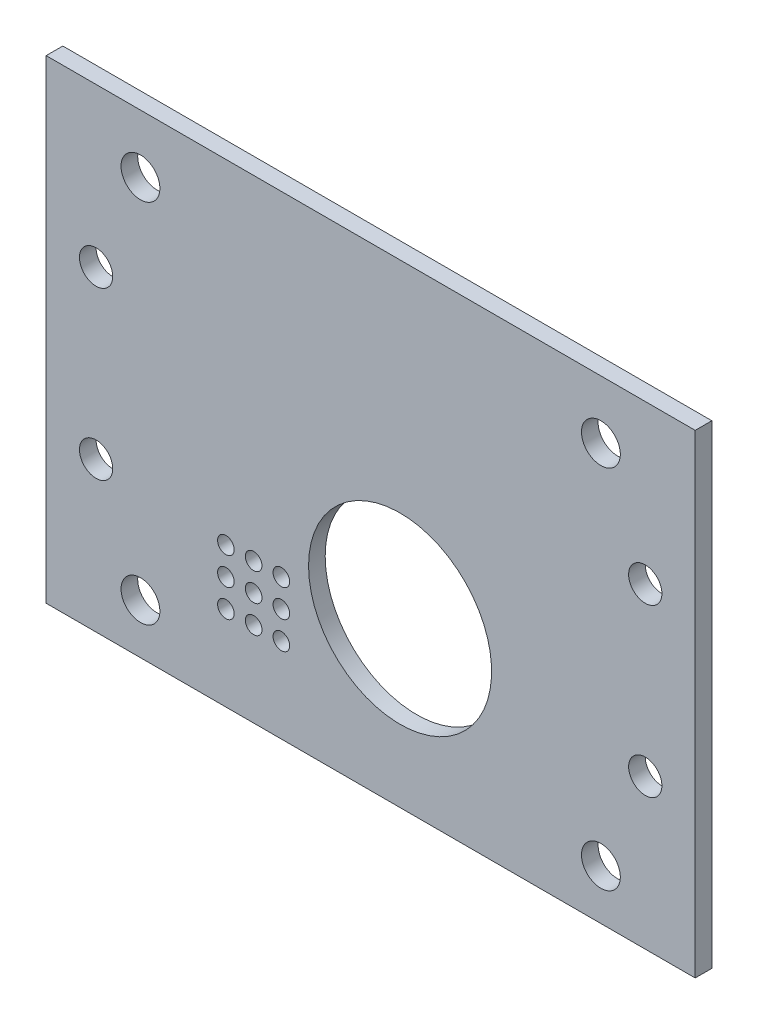
ISO-10303-21;
HEADER;
FILE_DESCRIPTION(('STEP AP214'),'2;1');
FILE_NAME('part.step','',(''),(''),'','','');
FILE_SCHEMA(('AUTOMOTIVE_DESIGN { 1 0 10303 214 1 1 1 1 }'));
ENDSEC;
DATA;
#1=APPLICATION_CONTEXT('core data for automotive mechanical design processes');
#2=APPLICATION_PROTOCOL_DEFINITION('international standard','automotive_design',2000,#1);
#3=PRODUCT_CONTEXT('',#1,'mechanical');
#4=PRODUCT('Part','Part','',(#3));
#5=PRODUCT_RELATED_PRODUCT_CATEGORY('part','',(#4));
#6=PRODUCT_DEFINITION_FORMATION('','',#4);
#7=PRODUCT_DEFINITION_CONTEXT('part definition',#1,'design');
#8=PRODUCT_DEFINITION('design','',#6,#7);
#9=PRODUCT_DEFINITION_SHAPE('','',#8);
#10=(LENGTH_UNIT() NAMED_UNIT(*) SI_UNIT(.MILLI.,.METRE.));
#11=(NAMED_UNIT(*) PLANE_ANGLE_UNIT() SI_UNIT($,.RADIAN.));
#12=(NAMED_UNIT(*) SI_UNIT($,.STERADIAN.) SOLID_ANGLE_UNIT());
#13=UNCERTAINTY_MEASURE_WITH_UNIT(LENGTH_MEASURE(1.E-05),#10,'distance_accuracy_value','');
#14=(GEOMETRIC_REPRESENTATION_CONTEXT(3) GLOBAL_UNCERTAINTY_ASSIGNED_CONTEXT((#13)) GLOBAL_UNIT_ASSIGNED_CONTEXT((#10,
#11,#12)) REPRESENTATION_CONTEXT('',''));
#15=CARTESIAN_POINT('',(0.,0.,0.));
#16=DIRECTION('',(0.,0.,1.));
#17=DIRECTION('',(1.,0.,0.));
#18=AXIS2_PLACEMENT_3D('',#15,#16,#17);
#19=CARTESIAN_POINT('',(-5.,-2.,3.));
#20=DIRECTION('',(1.,0.,0.));
#21=DIRECTION('',(0.,0.,-1.));
#22=AXIS2_PLACEMENT_3D('',#19,#20,#21);
#23=PLANE('',#22);
#24=DIRECTION('',(0.,-1.,0.));
#25=VECTOR('',#24,1.);
#26=CARTESIAN_POINT('',(-5.,-2.,0.));
#27=LINE('',#26,#25);
#28=CARTESIAN_POINT('',(-5.,83.5,0.));
#29=VERTEX_POINT('',#28);
#30=CARTESIAN_POINT('',(-5.,-2.,0.));
#31=VERTEX_POINT('',#30);
#32=EDGE_CURVE('E82',#29,#31,#27,.T.);
#33=ORIENTED_EDGE('',*,*,#32,.T.);
#34=DIRECTION('',(0.,0.,-1.));
#35=VECTOR('',#34,1.);
#36=CARTESIAN_POINT('',(-5.,-2.,3.));
#37=LINE('',#36,#35);
#38=CARTESIAN_POINT('',(-5.,-2.,3.));
#39=VERTEX_POINT('',#38);
#40=EDGE_CURVE('E11',#39,#31,#37,.T.);
#41=ORIENTED_EDGE('',*,*,#40,.F.);
#42=DIRECTION('',(0.,-1.,0.));
#43=VECTOR('',#42,1.);
#44=CARTESIAN_POINT('',(-5.,-2.,3.));
#45=LINE('',#44,#43);
#46=CARTESIAN_POINT('',(-5.,83.5,3.));
#47=VERTEX_POINT('',#46);
#48=EDGE_CURVE('E73',#47,#39,#45,.T.);
#49=ORIENTED_EDGE('',*,*,#48,.F.);
#50=DIRECTION('',(0.,0.,-1.));
#51=VECTOR('',#50,1.);
#52=CARTESIAN_POINT('',(-5.,83.5,3.));
#53=LINE('',#52,#51);
#54=EDGE_CURVE('E93',#47,#29,#53,.T.);
#55=ORIENTED_EDGE('',*,*,#54,.T.);
#56=EDGE_LOOP('',(#33,#41,#49,#55));
#57=FACE_BOUND('',#56,.T.);
#58=ADVANCED_FACE('F39',(#57),#23,.F.);
#59=CARTESIAN_POINT('',(-5.,-2.,3.));
#60=DIRECTION('',(0.,1.,0.));
#61=DIRECTION('',(0.,0.,1.));
#62=AXIS2_PLACEMENT_3D('',#59,#60,#61);
#63=PLANE('',#62);
#64=DIRECTION('',(1.,0.,0.));
#65=VECTOR('',#64,1.);
#66=CARTESIAN_POINT('',(-5.,-2.,0.));
#67=LINE('',#66,#65);
#68=CARTESIAN_POINT('',(112.,-2.,0.));
#69=VERTEX_POINT('',#68);
#70=EDGE_CURVE('E66',#31,#69,#67,.T.);
#71=ORIENTED_EDGE('',*,*,#70,.T.);
#72=DIRECTION('',(0.,0.,-1.));
#73=VECTOR('',#72,1.);
#74=CARTESIAN_POINT('',(112.,-2.,3.));
#75=LINE('',#74,#73);
#76=CARTESIAN_POINT('',(112.,-2.,3.));
#77=VERTEX_POINT('',#76);
#78=EDGE_CURVE('E47',#77,#69,#75,.T.);
#79=ORIENTED_EDGE('',*,*,#78,.F.);
#80=DIRECTION('',(1.,0.,0.));
#81=VECTOR('',#80,1.);
#82=CARTESIAN_POINT('',(-5.,-2.,3.));
#83=LINE('',#82,#81);
#84=EDGE_CURVE('E55',#39,#77,#83,.T.);
#85=ORIENTED_EDGE('',*,*,#84,.F.);
#86=ORIENTED_EDGE('',*,*,#40,.T.);
#87=EDGE_LOOP('',(#71,#79,#85,#86));
#88=FACE_BOUND('',#87,.T.);
#89=ADVANCED_FACE('F220',(#88),#63,.F.);
#90=CARTESIAN_POINT('',(112.,-2.,3.));
#91=DIRECTION('',(-1.,0.,0.));
#92=DIRECTION('',(0.,0.,1.));
#93=AXIS2_PLACEMENT_3D('',#90,#91,#92);
#94=PLANE('',#93);
#95=DIRECTION('',(0.,1.,0.));
#96=VECTOR('',#95,1.);
#97=CARTESIAN_POINT('',(112.,-2.,0.));
#98=LINE('',#97,#96);
#99=CARTESIAN_POINT('',(112.,83.5,0.));
#100=VERTEX_POINT('',#99);
#101=EDGE_CURVE('E210',#69,#100,#98,.T.);
#102=ORIENTED_EDGE('',*,*,#101,.T.);
#103=DIRECTION('',(0.,0.,-1.));
#104=VECTOR('',#103,1.);
#105=CARTESIAN_POINT('',(112.,83.5,3.));
#106=LINE('',#105,#104);
#107=CARTESIAN_POINT('',(112.,83.5,3.));
#108=VERTEX_POINT('',#107);
#109=EDGE_CURVE('E95',#108,#100,#106,.T.);
#110=ORIENTED_EDGE('',*,*,#109,.F.);
#111=DIRECTION('',(0.,1.,0.));
#112=VECTOR('',#111,1.);
#113=CARTESIAN_POINT('',(112.,-2.,3.));
#114=LINE('',#113,#112);
#115=EDGE_CURVE('E212',#77,#108,#114,.T.);
#116=ORIENTED_EDGE('',*,*,#115,.F.);
#117=ORIENTED_EDGE('',*,*,#78,.T.);
#118=EDGE_LOOP('',(#102,#110,#116,#117));
#119=FACE_BOUND('',#118,.T.);
#120=ADVANCED_FACE('F218',(#119),#94,.F.);
#121=CARTESIAN_POINT('',(0.,0.,3.));
#122=DIRECTION('',(0.,0.,-1.));
#123=DIRECTION('',(-1.,0.,0.));
#124=AXIS2_PLACEMENT_3D('',#121,#122,#123);
#125=PLANE('',#124);
#126=CARTESIAN_POINT('',(4.,55.,3.));
#127=DIRECTION('',(0.,0.,-1.));
#128=DIRECTION('',(-1.,0.,0.));
#129=AXIS2_PLACEMENT_3D('',#126,#127,#128);
#130=CIRCLE('',#129,3.);
#131=CARTESIAN_POINT('',(0.999999999999998,55.,3.));
#132=VERTEX_POINT('',#131);
#133=EDGE_CURVE('E123',#132,#132,#130,.F.);
#134=ORIENTED_EDGE('',*,*,#133,.F.);
#135=EDGE_LOOP('',(#134));
#136=FACE_BOUND('',#135,.T.);
#137=CARTESIAN_POINT('',(103.,25.,3.));
#138=DIRECTION('',(0.,0.,-1.));
#139=DIRECTION('',(-1.,0.,0.));
#140=AXIS2_PLACEMENT_3D('',#137,#138,#139);
#141=CIRCLE('',#140,3.00000000000001);
#142=CARTESIAN_POINT('',(100.,25.,3.));
#143=VERTEX_POINT('',#142);
#144=EDGE_CURVE('E120',#143,#143,#141,.F.);
#145=ORIENTED_EDGE('',*,*,#144,.F.);
#146=EDGE_LOOP('',(#145));
#147=FACE_BOUND('',#146,.T.);
#148=CARTESIAN_POINT('',(103.,55.,3.));
#149=DIRECTION('',(0.,0.,-1.));
#150=DIRECTION('',(-1.,0.,0.));
#151=AXIS2_PLACEMENT_3D('',#148,#149,#150);
#152=CIRCLE('',#151,3.00000000000001);
#153=CARTESIAN_POINT('',(100.,55.,3.));
#154=VERTEX_POINT('',#153);
#155=EDGE_CURVE('E117',#154,#154,#152,.F.);
#156=ORIENTED_EDGE('',*,*,#155,.F.);
#157=EDGE_LOOP('',(#156));
#158=FACE_BOUND('',#157,.T.);
#159=CARTESIAN_POINT('',(4.,25.,3.));
#160=DIRECTION('',(0.,0.,-1.));
#161=DIRECTION('',(-1.,0.,0.));
#162=AXIS2_PLACEMENT_3D('',#159,#160,#161);
#163=CIRCLE('',#162,3.);
#164=CARTESIAN_POINT('',(1.,25.,3.));
#165=VERTEX_POINT('',#164);
#166=EDGE_CURVE('E114',#165,#165,#163,.F.);
#167=ORIENTED_EDGE('',*,*,#166,.F.);
#168=EDGE_LOOP('',(#167));
#169=FACE_BOUND('',#168,.T.);
#170=CARTESIAN_POINT('',(27.4,18.3,3.));
#171=DIRECTION('',(0.,0.,-1.));
#172=DIRECTION('',(-1.,0.,0.));
#173=AXIS2_PLACEMENT_3D('',#170,#171,#172);
#174=CIRCLE('',#173,1.5);
#175=CARTESIAN_POINT('',(25.9,18.3,3.));
#176=VERTEX_POINT('',#175);
#177=EDGE_CURVE('E177',#176,#176,#174,.F.);
#178=ORIENTED_EDGE('',*,*,#177,.F.);
#179=EDGE_LOOP('',(#178));
#180=FACE_BOUND('',#179,.T.);
#181=CARTESIAN_POINT('',(27.4,23.3,3.));
#182=DIRECTION('',(0.,0.,-1.));
#183=DIRECTION('',(-1.,0.,0.));
#184=AXIS2_PLACEMENT_3D('',#181,#182,#183);
#185=CIRCLE('',#184,1.5);
#186=CARTESIAN_POINT('',(25.9,23.3,3.));
#187=VERTEX_POINT('',#186);
#188=EDGE_CURVE('E174',#187,#187,#185,.F.);
#189=ORIENTED_EDGE('',*,*,#188,.F.);
#190=EDGE_LOOP('',(#189));
#191=FACE_BOUND('',#190,.T.);
#192=CARTESIAN_POINT('',(32.4,13.3,3.));
#193=DIRECTION('',(0.,0.,-1.));
#194=DIRECTION('',(-1.,0.,0.));
#195=AXIS2_PLACEMENT_3D('',#192,#193,#194);
#196=CIRCLE('',#195,1.5);
#197=CARTESIAN_POINT('',(30.9,13.3,3.));
#198=VERTEX_POINT('',#197);
#199=EDGE_CURVE('E171',#198,#198,#196,.F.);
#200=ORIENTED_EDGE('',*,*,#199,.F.);
#201=EDGE_LOOP('',(#200));
#202=FACE_BOUND('',#201,.T.);
#203=CARTESIAN_POINT('',(32.4,18.3,3.));
#204=DIRECTION('',(0.,0.,-1.));
#205=DIRECTION('',(-1.,0.,0.));
#206=AXIS2_PLACEMENT_3D('',#203,#204,#205);
#207=CIRCLE('',#206,1.5);
#208=CARTESIAN_POINT('',(30.9,18.3,3.));
#209=VERTEX_POINT('',#208);
#210=EDGE_CURVE('E168',#209,#209,#207,.F.);
#211=ORIENTED_EDGE('',*,*,#210,.F.);
#212=EDGE_LOOP('',(#211));
#213=FACE_BOUND('',#212,.T.);
#214=CARTESIAN_POINT('',(37.4,23.3,3.));
#215=DIRECTION('',(0.,0.,-1.));
#216=DIRECTION('',(-1.,0.,0.));
#217=AXIS2_PLACEMENT_3D('',#214,#215,#216);
#218=CIRCLE('',#217,1.5);
#219=CARTESIAN_POINT('',(35.9,23.3,3.));
#220=VERTEX_POINT('',#219);
#221=EDGE_CURVE('E165',#220,#220,#218,.F.);
#222=ORIENTED_EDGE('',*,*,#221,.F.);
#223=EDGE_LOOP('',(#222));
#224=FACE_BOUND('',#223,.T.);
#225=CARTESIAN_POINT('',(37.4,18.3,3.));
#226=DIRECTION('',(0.,0.,-1.));
#227=DIRECTION('',(-1.,0.,0.));
#228=AXIS2_PLACEMENT_3D('',#225,#226,#227);
#229=CIRCLE('',#228,1.5);
#230=CARTESIAN_POINT('',(35.9,18.3,3.));
#231=VERTEX_POINT('',#230);
#232=EDGE_CURVE('E162',#231,#231,#229,.F.);
#233=ORIENTED_EDGE('',*,*,#232,.F.);
#234=EDGE_LOOP('',(#233));
#235=FACE_BOUND('',#234,.T.);
#236=CARTESIAN_POINT('',(37.4,13.3,3.));
#237=DIRECTION('',(0.,0.,-1.));
#238=DIRECTION('',(-1.,0.,0.));
#239=AXIS2_PLACEMENT_3D('',#236,#237,#238);
#240=CIRCLE('',#239,1.5);
#241=CARTESIAN_POINT('',(35.9,13.3,3.));
#242=VERTEX_POINT('',#241);
#243=EDGE_CURVE('E159',#242,#242,#240,.F.);
#244=ORIENTED_EDGE('',*,*,#243,.F.);
#245=EDGE_LOOP('',(#244));
#246=FACE_BOUND('',#245,.T.);
#247=CARTESIAN_POINT('',(32.4,23.3,3.));
#248=DIRECTION('',(0.,0.,-1.));
#249=DIRECTION('',(-1.,0.,0.));
#250=AXIS2_PLACEMENT_3D('',#247,#248,#249);
#251=CIRCLE('',#250,1.5);
#252=CARTESIAN_POINT('',(30.9,23.3,3.));
#253=VERTEX_POINT('',#252);
#254=EDGE_CURVE('E156',#253,#253,#251,.F.);
#255=ORIENTED_EDGE('',*,*,#254,.F.);
#256=EDGE_LOOP('',(#255));
#257=FACE_BOUND('',#256,.T.);
#258=CARTESIAN_POINT('',(27.4,13.3,3.));
#259=DIRECTION('',(0.,0.,-1.));
#260=DIRECTION('',(-1.,0.,0.));
#261=AXIS2_PLACEMENT_3D('',#258,#259,#260);
#262=CIRCLE('',#261,1.5);
#263=CARTESIAN_POINT('',(25.9,13.3,3.));
#264=VERTEX_POINT('',#263);
#265=EDGE_CURVE('E153',#264,#264,#262,.F.);
#266=ORIENTED_EDGE('',*,*,#265,.F.);
#267=EDGE_LOOP('',(#266));
#268=FACE_BOUND('',#267,.T.);
#269=CARTESIAN_POINT('',(58.8,27.5,3.));
#270=DIRECTION('',(0.,0.,-1.));
#271=DIRECTION('',(-1.,0.,0.));
#272=AXIS2_PLACEMENT_3D('',#269,#270,#271);
#273=CIRCLE('',#272,16.5);
#274=CARTESIAN_POINT('',(42.3,27.5,3.));
#275=VERTEX_POINT('',#274);
#276=EDGE_CURVE('E183',#275,#275,#273,.F.);
#277=ORIENTED_EDGE('',*,*,#276,.F.);
#278=EDGE_LOOP('',(#277));
#279=FACE_BOUND('',#278,.T.);
#280=CARTESIAN_POINT('',(95.,7.,3.));
#281=DIRECTION('',(0.,0.,-1.));
#282=DIRECTION('',(-1.,0.,0.));
#283=AXIS2_PLACEMENT_3D('',#280,#281,#282);
#284=CIRCLE('',#283,3.50000000000001);
#285=CARTESIAN_POINT('',(91.5,7.,3.));
#286=VERTEX_POINT('',#285);
#287=EDGE_CURVE('E86',#286,#286,#284,.F.);
#288=ORIENTED_EDGE('',*,*,#287,.F.);
#289=EDGE_LOOP('',(#288));
#290=FACE_BOUND('',#289,.T.);
#291=CARTESIAN_POINT('',(12.,73.,3.));
#292=DIRECTION('',(0.,0.,-1.));
#293=DIRECTION('',(-1.,0.,0.));
#294=AXIS2_PLACEMENT_3D('',#291,#292,#293);
#295=CIRCLE('',#294,3.5);
#296=CARTESIAN_POINT('',(8.5,73.,3.));
#297=VERTEX_POINT('',#296);
#298=EDGE_CURVE('E204',#297,#297,#295,.F.);
#299=ORIENTED_EDGE('',*,*,#298,.F.);
#300=EDGE_LOOP('',(#299));
#301=FACE_BOUND('',#300,.T.);
#302=CARTESIAN_POINT('',(95.,73.,3.));
#303=DIRECTION('',(0.,0.,-1.));
#304=DIRECTION('',(-1.,0.,0.));
#305=AXIS2_PLACEMENT_3D('',#302,#303,#304);
#306=CIRCLE('',#305,3.50000000000001);
#307=CARTESIAN_POINT('',(91.5,73.,3.));
#308=VERTEX_POINT('',#307);
#309=EDGE_CURVE('E201',#308,#308,#306,.F.);
#310=ORIENTED_EDGE('',*,*,#309,.F.);
#311=EDGE_LOOP('',(#310));
#312=FACE_BOUND('',#311,.T.);
#313=CARTESIAN_POINT('',(12.,7.,3.));
#314=DIRECTION('',(0.,0.,-1.));
#315=DIRECTION('',(-1.,0.,0.));
#316=AXIS2_PLACEMENT_3D('',#313,#314,#315);
#317=CIRCLE('',#316,3.5);
#318=CARTESIAN_POINT('',(8.5,7.,3.));
#319=VERTEX_POINT('',#318);
#320=EDGE_CURVE('E198',#319,#319,#317,.F.);
#321=ORIENTED_EDGE('',*,*,#320,.F.);
#322=EDGE_LOOP('',(#321));
#323=FACE_BOUND('',#322,.T.);
#324=ORIENTED_EDGE('',*,*,#48,.T.);
#325=ORIENTED_EDGE('',*,*,#84,.T.);
#326=ORIENTED_EDGE('',*,*,#115,.T.);
#327=DIRECTION('',(-1.,0.,0.));
#328=VECTOR('',#327,1.);
#329=CARTESIAN_POINT('',(-5.,83.5,3.));
#330=LINE('',#329,#328);
#331=EDGE_CURVE('E96',#108,#47,#330,.T.);
#332=ORIENTED_EDGE('',*,*,#331,.T.);
#333=EDGE_LOOP('',(#324,#325,#326,#332));
#334=FACE_BOUND('',#333,.T.);
#335=ADVANCED_FACE('F221',(#136,#147,#158,#169,#180,#191,#202,#213,#224,#235,#246,#257,#268,
#279,#290,#301,#312,#323,#334),#125,.F.);
#336=CARTESIAN_POINT('',(0.,0.,0.));
#337=DIRECTION('',(0.,0.,-1.));
#338=DIRECTION('',(-1.,0.,0.));
#339=AXIS2_PLACEMENT_3D('',#336,#337,#338);
#340=PLANE('',#339);
#341=CARTESIAN_POINT('',(4.,55.,0.));
#342=DIRECTION('',(0.,0.,1.));
#343=DIRECTION('',(1.,0.,0.));
#344=AXIS2_PLACEMENT_3D('',#341,#342,#343);
#345=CIRCLE('',#344,3.);
#346=CARTESIAN_POINT('',(7.,55.,0.));
#347=VERTEX_POINT('',#346);
#348=EDGE_CURVE('E106',#347,#347,#345,.T.);
#349=ORIENTED_EDGE('',*,*,#348,.T.);
#350=EDGE_LOOP('',(#349));
#351=FACE_BOUND('',#350,.T.);
#352=CARTESIAN_POINT('',(103.,25.,0.));
#353=DIRECTION('',(0.,0.,1.));
#354=DIRECTION('',(1.,0.,0.));
#355=AXIS2_PLACEMENT_3D('',#352,#353,#354);
#356=CIRCLE('',#355,3.00000000000001);
#357=CARTESIAN_POINT('',(106.,25.,0.));
#358=VERTEX_POINT('',#357);
#359=EDGE_CURVE('E105',#358,#358,#356,.T.);
#360=ORIENTED_EDGE('',*,*,#359,.T.);
#361=EDGE_LOOP('',(#360));
#362=FACE_BOUND('',#361,.T.);
#363=CARTESIAN_POINT('',(103.,55.,0.));
#364=DIRECTION('',(0.,0.,1.));
#365=DIRECTION('',(1.,0.,0.));
#366=AXIS2_PLACEMENT_3D('',#363,#364,#365);
#367=CIRCLE('',#366,3.00000000000001);
#368=CARTESIAN_POINT('',(106.,55.,0.));
#369=VERTEX_POINT('',#368);
#370=EDGE_CURVE('E99',#369,#369,#367,.T.);
#371=ORIENTED_EDGE('',*,*,#370,.T.);
#372=EDGE_LOOP('',(#371));
#373=FACE_BOUND('',#372,.T.);
#374=CARTESIAN_POINT('',(4.,25.,0.));
#375=DIRECTION('',(0.,0.,1.));
#376=DIRECTION('',(1.,0.,0.));
#377=AXIS2_PLACEMENT_3D('',#374,#375,#376);
#378=CIRCLE('',#377,3.);
#379=CARTESIAN_POINT('',(7.,25.,0.));
#380=VERTEX_POINT('',#379);
#381=EDGE_CURVE('E109',#380,#380,#378,.T.);
#382=ORIENTED_EDGE('',*,*,#381,.T.);
#383=EDGE_LOOP('',(#382));
#384=FACE_BOUND('',#383,.T.);
#385=CARTESIAN_POINT('',(27.4,18.3,0.));
#386=DIRECTION('',(0.,0.,1.));
#387=DIRECTION('',(1.,0.,0.));
#388=AXIS2_PLACEMENT_3D('',#385,#386,#387);
#389=CIRCLE('',#388,1.5);
#390=CARTESIAN_POINT('',(28.9,18.3,0.));
#391=VERTEX_POINT('',#390);
#392=EDGE_CURVE('E139',#391,#391,#389,.T.);
#393=ORIENTED_EDGE('',*,*,#392,.T.);
#394=EDGE_LOOP('',(#393));
#395=FACE_BOUND('',#394,.T.);
#396=CARTESIAN_POINT('',(27.4,23.3,0.));
#397=DIRECTION('',(0.,0.,1.));
#398=DIRECTION('',(1.,0.,0.));
#399=AXIS2_PLACEMENT_3D('',#396,#397,#398);
#400=CIRCLE('',#399,1.5);
#401=CARTESIAN_POINT('',(28.9,23.3,0.));
#402=VERTEX_POINT('',#401);
#403=EDGE_CURVE('E143',#402,#402,#400,.T.);
#404=ORIENTED_EDGE('',*,*,#403,.T.);
#405=EDGE_LOOP('',(#404));
#406=FACE_BOUND('',#405,.T.);
#407=CARTESIAN_POINT('',(32.4,13.3,0.));
#408=DIRECTION('',(0.,0.,1.));
#409=DIRECTION('',(1.,0.,0.));
#410=AXIS2_PLACEMENT_3D('',#407,#408,#409);
#411=CIRCLE('',#410,1.5);
#412=CARTESIAN_POINT('',(33.9,13.3,0.));
#413=VERTEX_POINT('',#412);
#414=EDGE_CURVE('E146',#413,#413,#411,.T.);
#415=ORIENTED_EDGE('',*,*,#414,.T.);
#416=EDGE_LOOP('',(#415));
#417=FACE_BOUND('',#416,.T.);
#418=CARTESIAN_POINT('',(32.4,18.3,0.));
#419=DIRECTION('',(0.,0.,1.));
#420=DIRECTION('',(1.,0.,0.));
#421=AXIS2_PLACEMENT_3D('',#418,#419,#420);
#422=CIRCLE('',#421,1.5);
#423=CARTESIAN_POINT('',(33.9,18.3,0.));
#424=VERTEX_POINT('',#423);
#425=EDGE_CURVE('E136',#424,#424,#422,.T.);
#426=ORIENTED_EDGE('',*,*,#425,.T.);
#427=EDGE_LOOP('',(#426));
#428=FACE_BOUND('',#427,.T.);
#429=CARTESIAN_POINT('',(37.4,23.3,0.));
#430=DIRECTION('',(0.,0.,1.));
#431=DIRECTION('',(1.,0.,0.));
#432=AXIS2_PLACEMENT_3D('',#429,#430,#431);
#433=CIRCLE('',#432,1.5);
#434=CARTESIAN_POINT('',(38.9,23.3,0.));
#435=VERTEX_POINT('',#434);
#436=EDGE_CURVE('E126',#435,#435,#433,.T.);
#437=ORIENTED_EDGE('',*,*,#436,.T.);
#438=EDGE_LOOP('',(#437));
#439=FACE_BOUND('',#438,.T.);
#440=CARTESIAN_POINT('',(37.4,18.3,0.));
#441=DIRECTION('',(0.,0.,1.));
#442=DIRECTION('',(1.,0.,0.));
#443=AXIS2_PLACEMENT_3D('',#440,#441,#442);
#444=CIRCLE('',#443,1.5);
#445=CARTESIAN_POINT('',(38.9,18.3,0.));
#446=VERTEX_POINT('',#445);
#447=EDGE_CURVE('E127',#446,#446,#444,.T.);
#448=ORIENTED_EDGE('',*,*,#447,.T.);
#449=EDGE_LOOP('',(#448));
#450=FACE_BOUND('',#449,.T.);
#451=CARTESIAN_POINT('',(37.4,13.3,0.));
#452=DIRECTION('',(0.,0.,1.));
#453=DIRECTION('',(1.,0.,0.));
#454=AXIS2_PLACEMENT_3D('',#451,#452,#453);
#455=CIRCLE('',#454,1.5);
#456=CARTESIAN_POINT('',(38.9,13.3,0.));
#457=VERTEX_POINT('',#456);
#458=EDGE_CURVE('E130',#457,#457,#455,.T.);
#459=ORIENTED_EDGE('',*,*,#458,.T.);
#460=EDGE_LOOP('',(#459));
#461=FACE_BOUND('',#460,.T.);
#462=CARTESIAN_POINT('',(32.4,23.3,0.));
#463=DIRECTION('',(0.,0.,1.));
#464=DIRECTION('',(1.,0.,0.));
#465=AXIS2_PLACEMENT_3D('',#462,#463,#464);
#466=CIRCLE('',#465,1.5);
#467=CARTESIAN_POINT('',(33.9,23.3,0.));
#468=VERTEX_POINT('',#467);
#469=EDGE_CURVE('E133',#468,#468,#466,.T.);
#470=ORIENTED_EDGE('',*,*,#469,.T.);
#471=EDGE_LOOP('',(#470));
#472=FACE_BOUND('',#471,.T.);
#473=CARTESIAN_POINT('',(27.4,13.3,0.));
#474=DIRECTION('',(0.,0.,1.));
#475=DIRECTION('',(1.,0.,0.));
#476=AXIS2_PLACEMENT_3D('',#473,#474,#475);
#477=CIRCLE('',#476,1.5);
#478=CARTESIAN_POINT('',(28.9,13.3,0.));
#479=VERTEX_POINT('',#478);
#480=EDGE_CURVE('E142',#479,#479,#477,.T.);
#481=ORIENTED_EDGE('',*,*,#480,.T.);
#482=EDGE_LOOP('',(#481));
#483=FACE_BOUND('',#482,.T.);
#484=CARTESIAN_POINT('',(58.8,27.5,0.));
#485=DIRECTION('',(0.,0.,1.));
#486=DIRECTION('',(1.,0.,0.));
#487=AXIS2_PLACEMENT_3D('',#484,#485,#486);
#488=CIRCLE('',#487,16.5);
#489=CARTESIAN_POINT('',(75.3,27.5,0.));
#490=VERTEX_POINT('',#489);
#491=EDGE_CURVE('E180',#490,#490,#488,.T.);
#492=ORIENTED_EDGE('',*,*,#491,.T.);
#493=EDGE_LOOP('',(#492));
#494=FACE_BOUND('',#493,.T.);
#495=CARTESIAN_POINT('',(95.,7.,0.));
#496=DIRECTION('',(0.,0.,1.));
#497=DIRECTION('',(1.,0.,0.));
#498=AXIS2_PLACEMENT_3D('',#495,#496,#497);
#499=CIRCLE('',#498,3.50000000000001);
#500=CARTESIAN_POINT('',(98.5,7.,0.));
#501=VERTEX_POINT('',#500);
#502=EDGE_CURVE('E190',#501,#501,#499,.T.);
#503=ORIENTED_EDGE('',*,*,#502,.T.);
#504=EDGE_LOOP('',(#503));
#505=FACE_BOUND('',#504,.T.);
#506=CARTESIAN_POINT('',(12.,73.,0.));
#507=DIRECTION('',(0.,0.,1.));
#508=DIRECTION('',(1.,0.,0.));
#509=AXIS2_PLACEMENT_3D('',#506,#507,#508);
#510=CIRCLE('',#509,3.5);
#511=CARTESIAN_POINT('',(15.5,73.,0.));
#512=VERTEX_POINT('',#511);
#513=EDGE_CURVE('E189',#512,#512,#510,.T.);
#514=ORIENTED_EDGE('',*,*,#513,.T.);
#515=EDGE_LOOP('',(#514));
#516=FACE_BOUND('',#515,.T.);
#517=CARTESIAN_POINT('',(95.,73.,0.));
#518=DIRECTION('',(0.,0.,1.));
#519=DIRECTION('',(1.,0.,0.));
#520=AXIS2_PLACEMENT_3D('',#517,#518,#519);
#521=CIRCLE('',#520,3.50000000000001);
#522=CARTESIAN_POINT('',(98.5,73.,0.));
#523=VERTEX_POINT('',#522);
#524=EDGE_CURVE('E186',#523,#523,#521,.T.);
#525=ORIENTED_EDGE('',*,*,#524,.T.);
#526=EDGE_LOOP('',(#525));
#527=FACE_BOUND('',#526,.T.);
#528=CARTESIAN_POINT('',(12.,7.,0.));
#529=DIRECTION('',(0.,0.,1.));
#530=DIRECTION('',(1.,0.,0.));
#531=AXIS2_PLACEMENT_3D('',#528,#529,#530);
#532=CIRCLE('',#531,3.5);
#533=CARTESIAN_POINT('',(15.5,7.,0.));
#534=VERTEX_POINT('',#533);
#535=EDGE_CURVE('E193',#534,#534,#532,.T.);
#536=ORIENTED_EDGE('',*,*,#535,.T.);
#537=EDGE_LOOP('',(#536));
#538=FACE_BOUND('',#537,.T.);
#539=ORIENTED_EDGE('',*,*,#32,.F.);
#540=DIRECTION('',(-1.,0.,0.));
#541=VECTOR('',#540,1.);
#542=CARTESIAN_POINT('',(-5.,83.5,0.));
#543=LINE('',#542,#541);
#544=EDGE_CURVE('E85',#100,#29,#543,.T.);
#545=ORIENTED_EDGE('',*,*,#544,.F.);
#546=ORIENTED_EDGE('',*,*,#101,.F.);
#547=ORIENTED_EDGE('',*,*,#70,.F.);
#548=EDGE_LOOP('',(#539,#545,#546,#547));
#549=FACE_BOUND('',#548,.T.);
#550=ADVANCED_FACE('F84',(#351,#362,#373,#384,#395,#406,#417,#428,#439,#450,#461,#472,#483,#494,
#505,#516,#527,#538,#549),#340,.T.);
#551=CARTESIAN_POINT('',(12.,7.,6.));
#552=DIRECTION('',(0.,0.,-1.));
#553=DIRECTION('',(-1.,0.,0.));
#554=AXIS2_PLACEMENT_3D('',#551,#552,#553);
#555=CYLINDRICAL_SURFACE('',#554,3.5);
#556=ORIENTED_EDGE('',*,*,#535,.F.);
#557=EDGE_LOOP('',(#556));
#558=FACE_BOUND('',#557,.T.);
#559=ORIENTED_EDGE('',*,*,#320,.T.);
#560=EDGE_LOOP('',(#559));
#561=FACE_BOUND('',#560,.T.);
#562=ADVANCED_FACE('F229',(#558,#561),#555,.F.);
#563=CARTESIAN_POINT('',(95.,73.,6.));
#564=DIRECTION('',(0.,0.,-1.));
#565=DIRECTION('',(-1.,0.,0.));
#566=AXIS2_PLACEMENT_3D('',#563,#564,#565);
#567=CYLINDRICAL_SURFACE('',#566,3.50000000000001);
#568=ORIENTED_EDGE('',*,*,#524,.F.);
#569=EDGE_LOOP('',(#568));
#570=FACE_BOUND('',#569,.T.);
#571=ORIENTED_EDGE('',*,*,#309,.T.);
#572=EDGE_LOOP('',(#571));
#573=FACE_BOUND('',#572,.T.);
#574=ADVANCED_FACE('F252',(#570,#573),#567,.F.);
#575=CARTESIAN_POINT('',(12.,73.,6.));
#576=DIRECTION('',(0.,0.,-1.));
#577=DIRECTION('',(-1.,0.,0.));
#578=AXIS2_PLACEMENT_3D('',#575,#576,#577);
#579=CYLINDRICAL_SURFACE('',#578,3.5);
#580=ORIENTED_EDGE('',*,*,#513,.F.);
#581=EDGE_LOOP('',(#580));
#582=FACE_BOUND('',#581,.T.);
#583=ORIENTED_EDGE('',*,*,#298,.T.);
#584=EDGE_LOOP('',(#583));
#585=FACE_BOUND('',#584,.T.);
#586=ADVANCED_FACE('F261',(#582,#585),#579,.F.);
#587=CARTESIAN_POINT('',(95.,7.,6.));
#588=DIRECTION('',(0.,0.,-1.));
#589=DIRECTION('',(-1.,0.,0.));
#590=AXIS2_PLACEMENT_3D('',#587,#588,#589);
#591=CYLINDRICAL_SURFACE('',#590,3.50000000000001);
#592=ORIENTED_EDGE('',*,*,#502,.F.);
#593=EDGE_LOOP('',(#592));
#594=FACE_BOUND('',#593,.T.);
#595=ORIENTED_EDGE('',*,*,#287,.T.);
#596=EDGE_LOOP('',(#595));
#597=FACE_BOUND('',#596,.T.);
#598=ADVANCED_FACE('F270',(#594,#597),#591,.F.);
#599=CARTESIAN_POINT('',(58.8,27.5,6.));
#600=DIRECTION('',(0.,0.,-1.));
#601=DIRECTION('',(-1.,0.,0.));
#602=AXIS2_PLACEMENT_3D('',#599,#600,#601);
#603=CYLINDRICAL_SURFACE('',#602,16.5);
#604=ORIENTED_EDGE('',*,*,#491,.F.);
#605=EDGE_LOOP('',(#604));
#606=FACE_BOUND('',#605,.T.);
#607=ORIENTED_EDGE('',*,*,#276,.T.);
#608=EDGE_LOOP('',(#607));
#609=FACE_BOUND('',#608,.T.);
#610=ADVANCED_FACE('F279',(#606,#609),#603,.F.);
#611=CARTESIAN_POINT('',(27.4,13.3,6.));
#612=DIRECTION('',(0.,0.,-1.));
#613=DIRECTION('',(-1.,0.,0.));
#614=AXIS2_PLACEMENT_3D('',#611,#612,#613);
#615=CYLINDRICAL_SURFACE('',#614,1.5);
#616=ORIENTED_EDGE('',*,*,#480,.F.);
#617=EDGE_LOOP('',(#616));
#618=FACE_BOUND('',#617,.T.);
#619=ORIENTED_EDGE('',*,*,#265,.T.);
#620=EDGE_LOOP('',(#619));
#621=FACE_BOUND('',#620,.T.);
#622=ADVANCED_FACE('F288',(#618,#621),#615,.F.);
#623=CARTESIAN_POINT('',(32.4,23.3,6.));
#624=DIRECTION('',(0.,0.,-1.));
#625=DIRECTION('',(-1.,0.,0.));
#626=AXIS2_PLACEMENT_3D('',#623,#624,#625);
#627=CYLINDRICAL_SURFACE('',#626,1.5);
#628=ORIENTED_EDGE('',*,*,#469,.F.);
#629=EDGE_LOOP('',(#628));
#630=FACE_BOUND('',#629,.T.);
#631=ORIENTED_EDGE('',*,*,#254,.T.);
#632=EDGE_LOOP('',(#631));
#633=FACE_BOUND('',#632,.T.);
#634=ADVANCED_FACE('F297',(#630,#633),#627,.F.);
#635=CARTESIAN_POINT('',(37.4,13.3,6.));
#636=DIRECTION('',(0.,0.,-1.));
#637=DIRECTION('',(-1.,0.,0.));
#638=AXIS2_PLACEMENT_3D('',#635,#636,#637);
#639=CYLINDRICAL_SURFACE('',#638,1.5);
#640=ORIENTED_EDGE('',*,*,#458,.F.);
#641=EDGE_LOOP('',(#640));
#642=FACE_BOUND('',#641,.T.);
#643=ORIENTED_EDGE('',*,*,#243,.T.);
#644=EDGE_LOOP('',(#643));
#645=FACE_BOUND('',#644,.T.);
#646=ADVANCED_FACE('F306',(#642,#645),#639,.F.);
#647=CARTESIAN_POINT('',(37.4,18.3,6.));
#648=DIRECTION('',(0.,0.,-1.));
#649=DIRECTION('',(-1.,0.,0.));
#650=AXIS2_PLACEMENT_3D('',#647,#648,#649);
#651=CYLINDRICAL_SURFACE('',#650,1.5);
#652=ORIENTED_EDGE('',*,*,#447,.F.);
#653=EDGE_LOOP('',(#652));
#654=FACE_BOUND('',#653,.T.);
#655=ORIENTED_EDGE('',*,*,#232,.T.);
#656=EDGE_LOOP('',(#655));
#657=FACE_BOUND('',#656,.T.);
#658=ADVANCED_FACE('F315',(#654,#657),#651,.F.);
#659=CARTESIAN_POINT('',(37.4,23.3,6.));
#660=DIRECTION('',(0.,0.,-1.));
#661=DIRECTION('',(-1.,0.,0.));
#662=AXIS2_PLACEMENT_3D('',#659,#660,#661);
#663=CYLINDRICAL_SURFACE('',#662,1.5);
#664=ORIENTED_EDGE('',*,*,#436,.F.);
#665=EDGE_LOOP('',(#664));
#666=FACE_BOUND('',#665,.T.);
#667=ORIENTED_EDGE('',*,*,#221,.T.);
#668=EDGE_LOOP('',(#667));
#669=FACE_BOUND('',#668,.T.);
#670=ADVANCED_FACE('F324',(#666,#669),#663,.F.);
#671=CARTESIAN_POINT('',(32.4,18.3,6.));
#672=DIRECTION('',(0.,0.,-1.));
#673=DIRECTION('',(-1.,0.,0.));
#674=AXIS2_PLACEMENT_3D('',#671,#672,#673);
#675=CYLINDRICAL_SURFACE('',#674,1.5);
#676=ORIENTED_EDGE('',*,*,#425,.F.);
#677=EDGE_LOOP('',(#676));
#678=FACE_BOUND('',#677,.T.);
#679=ORIENTED_EDGE('',*,*,#210,.T.);
#680=EDGE_LOOP('',(#679));
#681=FACE_BOUND('',#680,.T.);
#682=ADVANCED_FACE('F333',(#678,#681),#675,.F.);
#683=CARTESIAN_POINT('',(32.4,13.3,6.));
#684=DIRECTION('',(0.,0.,-1.));
#685=DIRECTION('',(-1.,0.,0.));
#686=AXIS2_PLACEMENT_3D('',#683,#684,#685);
#687=CYLINDRICAL_SURFACE('',#686,1.5);
#688=ORIENTED_EDGE('',*,*,#414,.F.);
#689=EDGE_LOOP('',(#688));
#690=FACE_BOUND('',#689,.T.);
#691=ORIENTED_EDGE('',*,*,#199,.T.);
#692=EDGE_LOOP('',(#691));
#693=FACE_BOUND('',#692,.T.);
#694=ADVANCED_FACE('F342',(#690,#693),#687,.F.);
#695=CARTESIAN_POINT('',(27.4,23.3,6.));
#696=DIRECTION('',(0.,0.,-1.));
#697=DIRECTION('',(-1.,0.,0.));
#698=AXIS2_PLACEMENT_3D('',#695,#696,#697);
#699=CYLINDRICAL_SURFACE('',#698,1.5);
#700=ORIENTED_EDGE('',*,*,#403,.F.);
#701=EDGE_LOOP('',(#700));
#702=FACE_BOUND('',#701,.T.);
#703=ORIENTED_EDGE('',*,*,#188,.T.);
#704=EDGE_LOOP('',(#703));
#705=FACE_BOUND('',#704,.T.);
#706=ADVANCED_FACE('F351',(#702,#705),#699,.F.);
#707=CARTESIAN_POINT('',(27.4,18.3,6.));
#708=DIRECTION('',(0.,0.,-1.));
#709=DIRECTION('',(-1.,0.,0.));
#710=AXIS2_PLACEMENT_3D('',#707,#708,#709);
#711=CYLINDRICAL_SURFACE('',#710,1.5);
#712=ORIENTED_EDGE('',*,*,#392,.F.);
#713=EDGE_LOOP('',(#712));
#714=FACE_BOUND('',#713,.T.);
#715=ORIENTED_EDGE('',*,*,#177,.T.);
#716=EDGE_LOOP('',(#715));
#717=FACE_BOUND('',#716,.T.);
#718=ADVANCED_FACE('F360',(#714,#717),#711,.F.);
#719=CARTESIAN_POINT('',(4.,25.,6.));
#720=DIRECTION('',(0.,0.,-1.));
#721=DIRECTION('',(-1.,0.,0.));
#722=AXIS2_PLACEMENT_3D('',#719,#720,#721);
#723=CYLINDRICAL_SURFACE('',#722,3.);
#724=ORIENTED_EDGE('',*,*,#381,.F.);
#725=EDGE_LOOP('',(#724));
#726=FACE_BOUND('',#725,.T.);
#727=ORIENTED_EDGE('',*,*,#166,.T.);
#728=EDGE_LOOP('',(#727));
#729=FACE_BOUND('',#728,.T.);
#730=ADVANCED_FACE('F369',(#726,#729),#723,.F.);
#731=CARTESIAN_POINT('',(103.,55.,6.));
#732=DIRECTION('',(0.,0.,-1.));
#733=DIRECTION('',(-1.,0.,0.));
#734=AXIS2_PLACEMENT_3D('',#731,#732,#733);
#735=CYLINDRICAL_SURFACE('',#734,3.00000000000001);
#736=ORIENTED_EDGE('',*,*,#370,.F.);
#737=EDGE_LOOP('',(#736));
#738=FACE_BOUND('',#737,.T.);
#739=ORIENTED_EDGE('',*,*,#155,.T.);
#740=EDGE_LOOP('',(#739));
#741=FACE_BOUND('',#740,.T.);
#742=ADVANCED_FACE('F378',(#738,#741),#735,.F.);
#743=CARTESIAN_POINT('',(103.,25.,6.));
#744=DIRECTION('',(0.,0.,-1.));
#745=DIRECTION('',(-1.,0.,0.));
#746=AXIS2_PLACEMENT_3D('',#743,#744,#745);
#747=CYLINDRICAL_SURFACE('',#746,3.00000000000001);
#748=ORIENTED_EDGE('',*,*,#359,.F.);
#749=EDGE_LOOP('',(#748));
#750=FACE_BOUND('',#749,.T.);
#751=ORIENTED_EDGE('',*,*,#144,.T.);
#752=EDGE_LOOP('',(#751));
#753=FACE_BOUND('',#752,.T.);
#754=ADVANCED_FACE('F387',(#750,#753),#747,.F.);
#755=CARTESIAN_POINT('',(4.,55.,6.));
#756=DIRECTION('',(0.,0.,-1.));
#757=DIRECTION('',(-1.,0.,0.));
#758=AXIS2_PLACEMENT_3D('',#755,#756,#757);
#759=CYLINDRICAL_SURFACE('',#758,3.);
#760=ORIENTED_EDGE('',*,*,#348,.F.);
#761=EDGE_LOOP('',(#760));
#762=FACE_BOUND('',#761,.T.);
#763=ORIENTED_EDGE('',*,*,#133,.T.);
#764=EDGE_LOOP('',(#763));
#765=FACE_BOUND('',#764,.T.);
#766=ADVANCED_FACE('F395',(#762,#765),#759,.F.);
#767=CARTESIAN_POINT('',(-5.,83.5,3.));
#768=DIRECTION('',(0.,-1.,0.));
#769=DIRECTION('',(0.,0.,-1.));
#770=AXIS2_PLACEMENT_3D('',#767,#768,#769);
#771=PLANE('',#770);
#772=ORIENTED_EDGE('',*,*,#544,.T.);
#773=ORIENTED_EDGE('',*,*,#54,.F.);
#774=ORIENTED_EDGE('',*,*,#331,.F.);
#775=ORIENTED_EDGE('',*,*,#109,.T.);
#776=EDGE_LOOP('',(#772,#773,#774,#775));
#777=FACE_BOUND('',#776,.T.);
#778=ADVANCED_FACE('F91',(#777),#771,.F.);
#779=CLOSED_SHELL('',(#58,#89,#120,#335,#550,#562,#574,#586,#598,#610,#622,#634,#646,#658,#670,
#682,#694,#706,#718,#730,#742,#754,#766,#778));
#780=MANIFOLD_SOLID_BREP('B2',#779);
#781=ADVANCED_BREP_SHAPE_REPRESENTATION('',(#18,#780),#14);
#782=SHAPE_DEFINITION_REPRESENTATION(#9,#781);
ENDSEC;
END-ISO-10303-21;
